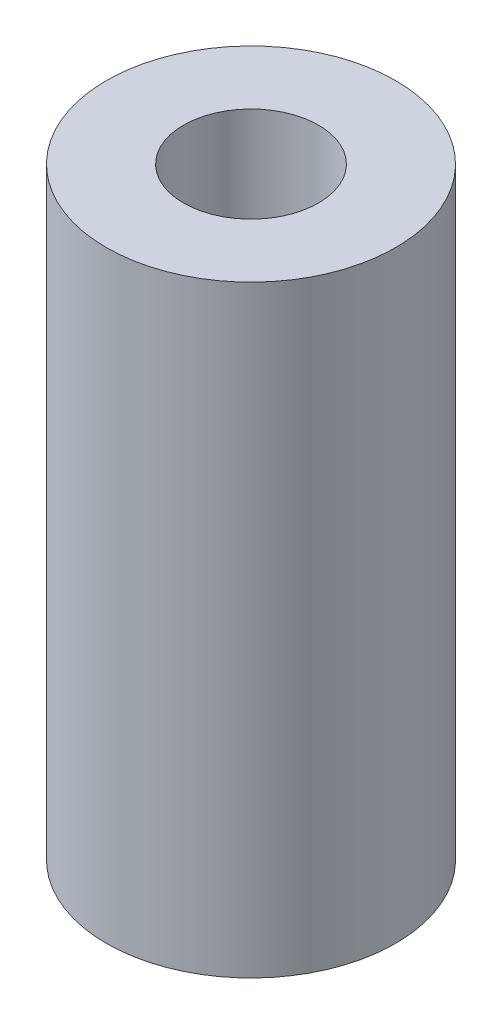
ISO-10303-21;
HEADER;
FILE_DESCRIPTION(('STEP AP214'),'2;1');
FILE_NAME('part.step','',(''),(''),'','','');
FILE_SCHEMA(('AUTOMOTIVE_DESIGN { 1 0 10303 214 1 1 1 1 }'));
ENDSEC;
DATA;
#1=APPLICATION_CONTEXT('core data for automotive mechanical design processes');
#2=APPLICATION_PROTOCOL_DEFINITION('international standard','automotive_design',2000,#1);
#3=PRODUCT_CONTEXT('',#1,'mechanical');
#4=PRODUCT('Part','Part','',(#3));
#5=PRODUCT_RELATED_PRODUCT_CATEGORY('part','',(#4));
#6=PRODUCT_DEFINITION_FORMATION('','',#4);
#7=PRODUCT_DEFINITION_CONTEXT('part definition',#1,'design');
#8=PRODUCT_DEFINITION('design','',#6,#7);
#9=PRODUCT_DEFINITION_SHAPE('','',#8);
#10=(LENGTH_UNIT() NAMED_UNIT(*) SI_UNIT(.MILLI.,.METRE.));
#11=(NAMED_UNIT(*) PLANE_ANGLE_UNIT() SI_UNIT($,.RADIAN.));
#12=(NAMED_UNIT(*) SI_UNIT($,.STERADIAN.) SOLID_ANGLE_UNIT());
#13=UNCERTAINTY_MEASURE_WITH_UNIT(LENGTH_MEASURE(1.E-05),#10,'distance_accuracy_value','');
#14=(GEOMETRIC_REPRESENTATION_CONTEXT(3) GLOBAL_UNCERTAINTY_ASSIGNED_CONTEXT((#13)) GLOBAL_UNIT_ASSIGNED_CONTEXT((#10,
#11,#12)) REPRESENTATION_CONTEXT('',''));
#15=CARTESIAN_POINT('',(0.,0.,0.));
#16=DIRECTION('',(0.,0.,1.));
#17=DIRECTION('',(1.,0.,0.));
#18=AXIS2_PLACEMENT_3D('',#15,#16,#17);
#19=CARTESIAN_POINT('',(112.753926627141,12.5,14.9581468740195));
#20=DIRECTION('',(0.,-1.,0.));
#21=DIRECTION('',(0.,0.,-1.));
#22=AXIS2_PLACEMENT_3D('',#19,#20,#21);
#23=CYLINDRICAL_SURFACE('',#22,3.00000000000001);
#24=CARTESIAN_POINT('',(112.753926627141,12.5,14.9581468740195));
#25=DIRECTION('',(0.,1.,0.));
#26=DIRECTION('',(0.,0.,1.));
#27=AXIS2_PLACEMENT_3D('',#24,#25,#26);
#28=CIRCLE('',#27,3.00000000000001);
#29=CARTESIAN_POINT('',(112.753926627141,12.5,17.9581468740195));
#30=VERTEX_POINT('',#29);
#31=EDGE_CURVE('E10',#30,#30,#28,.T.);
#32=ORIENTED_EDGE('',*,*,#31,.F.);
#33=EDGE_LOOP('',(#32));
#34=FACE_BOUND('',#33,.T.);
#35=CARTESIAN_POINT('',(112.753926627141,0.,14.9581468740195));
#36=DIRECTION('',(0.,1.,0.));
#37=DIRECTION('',(0.,0.,1.));
#38=AXIS2_PLACEMENT_3D('',#35,#36,#37);
#39=CIRCLE('',#38,3.00000000000001);
#40=CARTESIAN_POINT('',(112.753926627141,0.,17.9581468740195));
#41=VERTEX_POINT('',#40);
#42=EDGE_CURVE('E42',#41,#41,#39,.T.);
#43=ORIENTED_EDGE('',*,*,#42,.T.);
#44=EDGE_LOOP('',(#43));
#45=FACE_BOUND('',#44,.T.);
#46=ADVANCED_FACE('F39',(#34,#45),#23,.T.);
#47=CARTESIAN_POINT('',(0.,12.5,0.));
#48=DIRECTION('',(0.,1.,0.));
#49=DIRECTION('',(0.,0.,1.));
#50=AXIS2_PLACEMENT_3D('',#47,#48,#49);
#51=PLANE('',#50);
#52=CARTESIAN_POINT('',(112.753926627141,12.5,14.9581468740195));
#53=DIRECTION('',(0.,1.,0.));
#54=DIRECTION('',(0.,0.,1.));
#55=AXIS2_PLACEMENT_3D('',#52,#53,#54);
#56=CIRCLE('',#55,1.4);
#57=CARTESIAN_POINT('',(112.753926627141,12.5,16.3581468740195));
#58=VERTEX_POINT('',#57);
#59=EDGE_CURVE('E51',#58,#58,#56,.T.);
#60=ORIENTED_EDGE('',*,*,#59,.F.);
#61=EDGE_LOOP('',(#60));
#62=FACE_BOUND('',#61,.T.);
#63=ORIENTED_EDGE('',*,*,#31,.T.);
#64=EDGE_LOOP('',(#63));
#65=FACE_BOUND('',#64,.T.);
#66=ADVANCED_FACE('F66',(#62,#65),#51,.T.);
#67=CARTESIAN_POINT('',(0.,0.,0.));
#68=DIRECTION('',(0.,1.,0.));
#69=DIRECTION('',(0.,0.,1.));
#70=AXIS2_PLACEMENT_3D('',#67,#68,#69);
#71=PLANE('',#70);
#72=ORIENTED_EDGE('',*,*,#42,.F.);
#73=EDGE_LOOP('',(#72));
#74=FACE_BOUND('',#73,.T.);
#75=ADVANCED_FACE('F62',(#74),#71,.F.);
#76=CARTESIAN_POINT('',(112.753926627141,2.5,14.9581468740195));
#77=DIRECTION('',(0.,1.,0.));
#78=DIRECTION('',(0.,0.,1.));
#79=AXIS2_PLACEMENT_3D('',#76,#77,#78);
#80=CYLINDRICAL_SURFACE('',#79,1.4);
#81=CARTESIAN_POINT('',(112.753926627141,2.5,14.9581468740195));
#82=DIRECTION('',(0.,1.,0.));
#83=DIRECTION('',(0.,0.,1.));
#84=AXIS2_PLACEMENT_3D('',#81,#82,#83);
#85=CIRCLE('',#84,1.4);
#86=CARTESIAN_POINT('',(112.753926627141,2.5,16.3581468740195));
#87=VERTEX_POINT('',#86);
#88=EDGE_CURVE('E49',#87,#87,#85,.T.);
#89=ORIENTED_EDGE('',*,*,#88,.F.);
#90=EDGE_LOOP('',(#89));
#91=FACE_BOUND('',#90,.T.);
#92=ORIENTED_EDGE('',*,*,#59,.T.);
#93=EDGE_LOOP('',(#92));
#94=FACE_BOUND('',#93,.T.);
#95=ADVANCED_FACE('F59',(#91,#94),#80,.F.);
#96=CARTESIAN_POINT('',(112.753926627141,2.5,14.9581468740195));
#97=DIRECTION('',(0.,1.,0.));
#98=DIRECTION('',(0.,0.,1.));
#99=AXIS2_PLACEMENT_3D('',#96,#97,#98);
#100=PLANE('',#99);
#101=ORIENTED_EDGE('',*,*,#88,.T.);
#102=EDGE_LOOP('',(#101));
#103=FACE_BOUND('',#102,.T.);
#104=ADVANCED_FACE('F57',(#103),#100,.T.);
#105=CLOSED_SHELL('',(#46,#66,#75,#95,#104));
#106=MANIFOLD_SOLID_BREP('B2',#105);
#107=ADVANCED_BREP_SHAPE_REPRESENTATION('',(#18,#106),#14);
#108=SHAPE_DEFINITION_REPRESENTATION(#9,#107);
ENDSEC;
END-ISO-10303-21;
